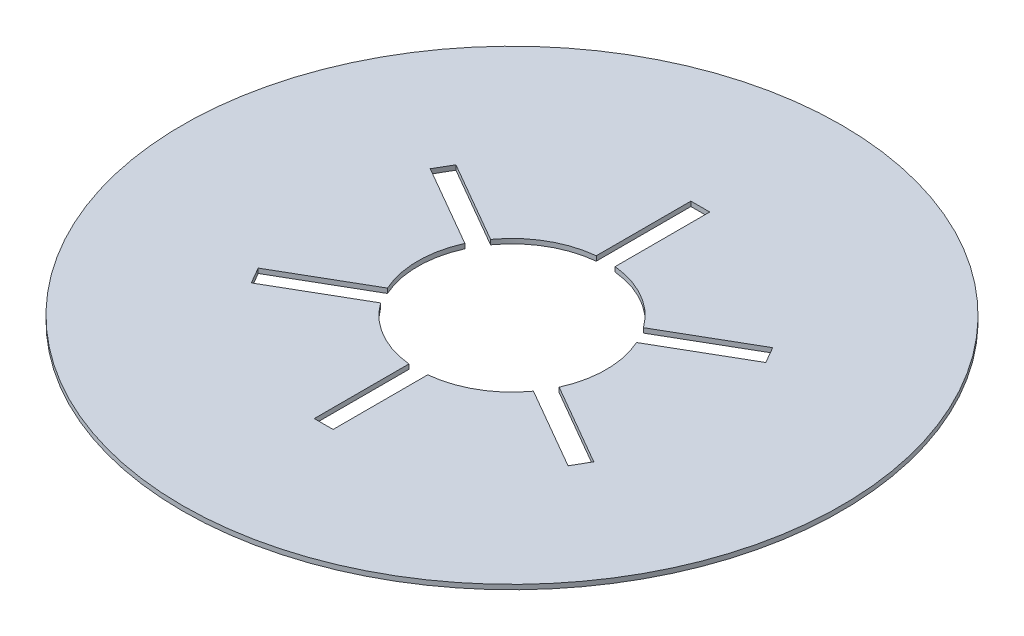
ISO-10303-21;
HEADER;
FILE_DESCRIPTION(('STEP AP214'),'2;1');
FILE_NAME('part.step','',(''),(''),'','','');
FILE_SCHEMA(('AUTOMOTIVE_DESIGN { 1 0 10303 214 1 1 1 1 }'));
ENDSEC;
DATA;
#1=APPLICATION_CONTEXT('core data for automotive mechanical design processes');
#2=APPLICATION_PROTOCOL_DEFINITION('international standard','automotive_design',2000,#1);
#3=PRODUCT_CONTEXT('',#1,'mechanical');
#4=PRODUCT('Part','Part','',(#3));
#5=PRODUCT_RELATED_PRODUCT_CATEGORY('part','',(#4));
#6=PRODUCT_DEFINITION_FORMATION('','',#4);
#7=PRODUCT_DEFINITION_CONTEXT('part definition',#1,'design');
#8=PRODUCT_DEFINITION('design','',#6,#7);
#9=PRODUCT_DEFINITION_SHAPE('','',#8);
#10=(LENGTH_UNIT() NAMED_UNIT(*) SI_UNIT(.MILLI.,.METRE.));
#11=(NAMED_UNIT(*) PLANE_ANGLE_UNIT() SI_UNIT($,.RADIAN.));
#12=(NAMED_UNIT(*) SI_UNIT($,.STERADIAN.) SOLID_ANGLE_UNIT());
#13=UNCERTAINTY_MEASURE_WITH_UNIT(LENGTH_MEASURE(1.E-05),#10,'distance_accuracy_value','');
#14=(GEOMETRIC_REPRESENTATION_CONTEXT(3) GLOBAL_UNCERTAINTY_ASSIGNED_CONTEXT((#13)) GLOBAL_UNIT_ASSIGNED_CONTEXT((#10,
#11,#12)) REPRESENTATION_CONTEXT('',''));
#15=CARTESIAN_POINT('',(0.,0.,0.));
#16=DIRECTION('',(0.,0.,1.));
#17=DIRECTION('',(1.,0.,0.));
#18=AXIS2_PLACEMENT_3D('',#15,#16,#17);
#19=CARTESIAN_POINT('',(0.,5.,0.));
#20=DIRECTION('',(0.,-1.,0.));
#21=DIRECTION('',(0.,0.,-1.));
#22=AXIS2_PLACEMENT_3D('',#19,#20,#21);
#23=CYLINDRICAL_SURFACE('',#22,100.);
#24=CARTESIAN_POINT('',(0.,0.,0.));
#25=DIRECTION('',(0.,1.,0.));
#26=DIRECTION('',(0.,0.,1.));
#27=AXIS2_PLACEMENT_3D('',#24,#25,#26);
#28=CIRCLE('',#27,100.);
#29=CARTESIAN_POINT('',(-81.1684396981752,0.,58.4096258930298));
#30=VERTEX_POINT('',#29);
#31=CARTESIAN_POINT('',(-10.,0.,99.498743710662));
#32=VERTEX_POINT('',#31);
#33=EDGE_CURVE('E227',#30,#32,#28,.T.);
#34=ORIENTED_EDGE('',*,*,#33,.F.);
#35=DIRECTION('',(0.,-1.,0.));
#36=VECTOR('',#35,1.);
#37=CARTESIAN_POINT('',(-81.1684396981752,5.,58.4096258930298));
#38=LINE('',#37,#36);
#39=CARTESIAN_POINT('',(-81.1684396981752,5.,58.4096258930298));
#40=VERTEX_POINT('',#39);
#41=EDGE_CURVE('E11',#40,#30,#38,.T.);
#42=ORIENTED_EDGE('',*,*,#41,.F.);
#43=CARTESIAN_POINT('',(0.,5.,0.));
#44=DIRECTION('',(0.,1.,0.));
#45=DIRECTION('',(0.,0.,1.));
#46=AXIS2_PLACEMENT_3D('',#43,#44,#45);
#47=CIRCLE('',#46,100.);
#48=CARTESIAN_POINT('',(-10.,5.,99.498743710662));
#49=VERTEX_POINT('',#48);
#50=EDGE_CURVE('E293',#40,#49,#47,.T.);
#51=ORIENTED_EDGE('',*,*,#50,.T.);
#52=DIRECTION('',(0.,-1.,0.));
#53=VECTOR('',#52,1.);
#54=CARTESIAN_POINT('',(-10.,5.,99.498743710662));
#55=LINE('',#54,#53);
#56=EDGE_CURVE('E49',#49,#32,#55,.T.);
#57=ORIENTED_EDGE('',*,*,#56,.T.);
#58=EDGE_LOOP('',(#34,#42,#51,#57));
#59=FACE_BOUND('',#58,.T.);
#60=ADVANCED_FACE('F33',(#59),#23,.F.);
#61=CARTESIAN_POINT('',(4.99999999991079,5.,8.66025403768987));
#62=DIRECTION('',(0.5,0.,0.866025403784439));
#63=DIRECTION('',(0.866025403784439,0.,-0.5));
#64=AXIS2_PLACEMENT_3D('',#61,#62,#63);
#65=PLANE('',#64);
#66=DIRECTION('',(-0.866025403784439,0.,0.5));
#67=VECTOR('',#66,1.);
#68=CARTESIAN_POINT('',(4.99999999991079,0.,8.66025403768987));
#69=LINE('',#68,#67);
#70=CARTESIAN_POINT('',(-168.205080756709,0.,108.660254037535));
#71=VERTEX_POINT('',#70);
#72=EDGE_CURVE('E229',#30,#71,#69,.T.);
#73=ORIENTED_EDGE('',*,*,#72,.T.);
#74=DIRECTION('',(0.,-1.,0.));
#75=VECTOR('',#74,1.);
#76=CARTESIAN_POINT('',(-168.205080756709,5.,108.660254037535));
#77=LINE('',#76,#75);
#78=CARTESIAN_POINT('',(-168.205080756709,5.,108.660254037535));
#79=VERTEX_POINT('',#78);
#80=EDGE_CURVE('E41',#79,#71,#77,.T.);
#81=ORIENTED_EDGE('',*,*,#80,.F.);
#82=DIRECTION('',(-0.866025403784439,0.,0.5));
#83=VECTOR('',#82,1.);
#84=CARTESIAN_POINT('',(4.99999999991079,5.,8.66025403768987));
#85=LINE('',#84,#83);
#86=EDGE_CURVE('E363',#40,#79,#85,.T.);
#87=ORIENTED_EDGE('',*,*,#86,.F.);
#88=ORIENTED_EDGE('',*,*,#41,.T.);
#89=EDGE_LOOP('',(#73,#81,#87,#88));
#90=FACE_BOUND('',#89,.T.);
#91=ADVANCED_FACE('F418',(#90),#65,.F.);
#92=CARTESIAN_POINT('',(-173.20508075662,5.,99.9999999998454));
#93=DIRECTION('',(-0.866025403784438,0.,0.5));
#94=DIRECTION('',(0.5,0.,0.866025403784438));
#95=AXIS2_PLACEMENT_3D('',#92,#93,#94);
#96=PLANE('',#95);
#97=DIRECTION('',(-0.5,0.,-0.866025403784438));
#98=VECTOR('',#97,1.);
#99=CARTESIAN_POINT('',(-173.20508075662,0.,99.9999999998454));
#100=LINE('',#99,#98);
#101=CARTESIAN_POINT('',(-178.205080756709,0.,91.3397459618464));
#102=VERTEX_POINT('',#101);
#103=EDGE_CURVE('E231',#71,#102,#100,.T.);
#104=ORIENTED_EDGE('',*,*,#103,.T.);
#105=DIRECTION('',(0.,-1.,0.));
#106=VECTOR('',#105,1.);
#107=CARTESIAN_POINT('',(-178.205080756709,5.,91.3397459618464));
#108=LINE('',#107,#106);
#109=CARTESIAN_POINT('',(-178.205080756709,5.,91.3397459618464));
#110=VERTEX_POINT('',#109);
#111=EDGE_CURVE('E335',#110,#102,#108,.T.);
#112=ORIENTED_EDGE('',*,*,#111,.F.);
#113=DIRECTION('',(-0.5,0.,-0.866025403784438));
#114=VECTOR('',#113,1.);
#115=CARTESIAN_POINT('',(-173.20508075662,5.,99.9999999998454));
#116=LINE('',#115,#114);
#117=EDGE_CURVE('E343',#79,#110,#116,.T.);
#118=ORIENTED_EDGE('',*,*,#117,.F.);
#119=ORIENTED_EDGE('',*,*,#80,.T.);
#120=EDGE_LOOP('',(#104,#112,#118,#119));
#121=FACE_BOUND('',#120,.T.);
#122=ADVANCED_FACE('F341',(#121),#96,.F.);
#123=CARTESIAN_POINT('',(-5.00000000008927,5.,-8.660254037999));
#124=DIRECTION('',(0.5,0.,0.866025403784438));
#125=DIRECTION('',(0.866025403784438,0.,-0.5));
#126=AXIS2_PLACEMENT_3D('',#123,#124,#125);
#127=PLANE('',#126);
#128=DIRECTION('',(-0.866025403784439,0.,0.5));
#129=VECTOR('',#128,1.);
#130=CARTESIAN_POINT('',(-5.00000000008927,0.,-8.660254037999));
#131=LINE('',#130,#129);
#132=CARTESIAN_POINT('',(-91.1684396981441,0.,41.089117817323));
#133=VERTEX_POINT('',#132);
#134=EDGE_CURVE('E234',#133,#102,#131,.T.);
#135=ORIENTED_EDGE('',*,*,#134,.F.);
#136=DIRECTION('',(0.,-1.,0.));
#137=VECTOR('',#136,1.);
#138=CARTESIAN_POINT('',(-91.1684396981441,5.,41.089117817323));
#139=LINE('',#138,#137);
#140=CARTESIAN_POINT('',(-91.1684396981441,5.,41.089117817323));
#141=VERTEX_POINT('',#140);
#142=EDGE_CURVE('E333',#141,#133,#139,.T.);
#143=ORIENTED_EDGE('',*,*,#142,.F.);
#144=DIRECTION('',(-0.866025403784439,0.,0.5));
#145=VECTOR('',#144,1.);
#146=CARTESIAN_POINT('',(-5.00000000008927,5.,-8.660254037999));
#147=LINE('',#146,#145);
#148=EDGE_CURVE('E356',#141,#110,#147,.T.);
#149=ORIENTED_EDGE('',*,*,#148,.T.);
#150=ORIENTED_EDGE('',*,*,#111,.T.);
#151=EDGE_LOOP('',(#135,#143,#149,#150));
#152=FACE_BOUND('',#151,.T.);
#153=ADVANCED_FACE('F353',(#152),#127,.T.);
#154=CARTESIAN_POINT('',(0.,5.,0.));
#155=DIRECTION('',(0.,-1.,0.));
#156=DIRECTION('',(0.,0.,-1.));
#157=AXIS2_PLACEMENT_3D('',#154,#155,#156);
#158=CYLINDRICAL_SURFACE('',#157,100.);
#159=CARTESIAN_POINT('',(0.,0.,0.));
#160=DIRECTION('',(0.,1.,0.));
#161=DIRECTION('',(0.,0.,1.));
#162=AXIS2_PLACEMENT_3D('',#159,#160,#161);
#163=CIRCLE('',#162,100.);
#164=CARTESIAN_POINT('',(-91.1684396979967,0.,-41.0891178176502));
#165=VERTEX_POINT('',#164);
#166=EDGE_CURVE('E237',#165,#133,#163,.T.);
#167=ORIENTED_EDGE('',*,*,#166,.F.);
#168=DIRECTION('',(0.,-1.,0.));
#169=VECTOR('',#168,1.);
#170=CARTESIAN_POINT('',(-91.1684396979967,5.,-41.0891178176502));
#171=LINE('',#170,#169);
#172=CARTESIAN_POINT('',(-91.1684396979967,5.,-41.0891178176502));
#173=VERTEX_POINT('',#172);
#174=EDGE_CURVE('E331',#173,#165,#171,.T.);
#175=ORIENTED_EDGE('',*,*,#174,.F.);
#176=CARTESIAN_POINT('',(0.,5.,0.));
#177=DIRECTION('',(0.,1.,0.));
#178=DIRECTION('',(0.,0.,1.));
#179=AXIS2_PLACEMENT_3D('',#176,#177,#178);
#180=CIRCLE('',#179,100.);
#181=EDGE_CURVE('E359',#173,#141,#180,.T.);
#182=ORIENTED_EDGE('',*,*,#181,.T.);
#183=ORIENTED_EDGE('',*,*,#142,.T.);
#184=EDGE_LOOP('',(#167,#175,#182,#183));
#185=FACE_BOUND('',#184,.T.);
#186=ADVANCED_FACE('F429',(#185),#158,.F.);
#187=CARTESIAN_POINT('',(-4.9999999999107,5.,8.66025403768974));
#188=DIRECTION('',(-0.499999999999999,0.,0.866025403784439));
#189=DIRECTION('',(0.866025403784439,0.,0.499999999999999));
#190=AXIS2_PLACEMENT_3D('',#187,#188,#189);
#191=PLANE('',#190);
#192=DIRECTION('',(-0.866025403784439,0.,-0.499999999999999));
#193=VECTOR('',#192,1.);
#194=CARTESIAN_POINT('',(-4.9999999999107,0.,8.66025403768974));
#195=LINE('',#194,#193);
#196=CARTESIAN_POINT('',(-178.205080756709,0.,-91.3397459622586));
#197=VERTEX_POINT('',#196);
#198=EDGE_CURVE('E240',#165,#197,#195,.T.);
#199=ORIENTED_EDGE('',*,*,#198,.T.);
#200=DIRECTION('',(0.,-1.,0.));
#201=VECTOR('',#200,1.);
#202=CARTESIAN_POINT('',(-178.205080756709,5.,-91.3397459622586));
#203=LINE('',#202,#201);
#204=CARTESIAN_POINT('',(-178.205080756709,5.,-91.3397459622586));
#205=VERTEX_POINT('',#204);
#206=EDGE_CURVE('E328',#205,#197,#203,.T.);
#207=ORIENTED_EDGE('',*,*,#206,.F.);
#208=DIRECTION('',(-0.866025403784439,0.,-0.499999999999999));
#209=VECTOR('',#208,1.);
#210=CARTESIAN_POINT('',(-4.9999999999107,5.,8.66025403768974));
#211=LINE('',#210,#209);
#212=EDGE_CURVE('E361',#173,#205,#211,.T.);
#213=ORIENTED_EDGE('',*,*,#212,.F.);
#214=ORIENTED_EDGE('',*,*,#174,.T.);
#215=EDGE_LOOP('',(#199,#207,#213,#214));
#216=FACE_BOUND('',#215,.T.);
#217=ADVANCED_FACE('F432',(#216),#191,.F.);
#218=CARTESIAN_POINT('',(-173.205080756798,5.,-99.9999999999485));
#219=DIRECTION('',(-0.866025403784438,0.,-0.5));
#220=DIRECTION('',(-0.5,0.,0.866025403784438));
#221=AXIS2_PLACEMENT_3D('',#218,#219,#220);
#222=PLANE('',#221);
#223=DIRECTION('',(0.5,0.,-0.866025403784438));
#224=VECTOR('',#223,1.);
#225=CARTESIAN_POINT('',(-173.205080756798,0.,-99.9999999999485));
#226=LINE('',#225,#224);
#227=CARTESIAN_POINT('',(-168.205080756709,0.,-108.660254037947));
#228=VERTEX_POINT('',#227);
#229=EDGE_CURVE('E242',#197,#228,#226,.T.);
#230=ORIENTED_EDGE('',*,*,#229,.T.);
#231=DIRECTION('',(0.,-1.,0.));
#232=VECTOR('',#231,1.);
#233=CARTESIAN_POINT('',(-168.205080756709,5.,-108.660254037947));
#234=LINE('',#233,#232);
#235=CARTESIAN_POINT('',(-168.205080756709,5.,-108.660254037947));
#236=VERTEX_POINT('',#235);
#237=EDGE_CURVE('E326',#236,#228,#234,.T.);
#238=ORIENTED_EDGE('',*,*,#237,.F.);
#239=DIRECTION('',(0.5,0.,-0.866025403784438));
#240=VECTOR('',#239,1.);
#241=CARTESIAN_POINT('',(-173.205080756798,5.,-99.9999999999485));
#242=LINE('',#241,#240);
#243=EDGE_CURVE('E368',#205,#236,#242,.T.);
#244=ORIENTED_EDGE('',*,*,#243,.F.);
#245=ORIENTED_EDGE('',*,*,#206,.T.);
#246=EDGE_LOOP('',(#230,#238,#244,#245));
#247=FACE_BOUND('',#246,.T.);
#248=ADVANCED_FACE('F436',(#247),#222,.F.);
#249=CARTESIAN_POINT('',(5.00000000008936,5.,-8.6602540379992));
#250=DIRECTION('',(-0.499999999999999,0.,0.86602540378444));
#251=DIRECTION('',(0.86602540378444,0.,0.499999999999999));
#252=AXIS2_PLACEMENT_3D('',#249,#250,#251);
#253=PLANE('',#252);
#254=DIRECTION('',(-0.86602540378444,0.,-0.499999999999999));
#255=VECTOR('',#254,1.);
#256=CARTESIAN_POINT('',(5.00000000008936,0.,-8.6602540379992));
#257=LINE('',#256,#255);
#258=CARTESIAN_POINT('',(-81.1684396979656,0.,-58.4096258933211));
#259=VERTEX_POINT('',#258);
#260=EDGE_CURVE('E245',#259,#228,#257,.T.);
#261=ORIENTED_EDGE('',*,*,#260,.F.);
#262=DIRECTION('',(0.,-1.,0.));
#263=VECTOR('',#262,1.);
#264=CARTESIAN_POINT('',(-81.1684396979656,5.,-58.4096258933211));
#265=LINE('',#264,#263);
#266=CARTESIAN_POINT('',(-81.1684396979656,5.,-58.4096258933211));
#267=VERTEX_POINT('',#266);
#268=EDGE_CURVE('E324',#267,#259,#265,.T.);
#269=ORIENTED_EDGE('',*,*,#268,.F.);
#270=DIRECTION('',(-0.86602540378444,0.,-0.499999999999999));
#271=VECTOR('',#270,1.);
#272=CARTESIAN_POINT('',(5.00000000008936,5.,-8.6602540379992));
#273=LINE('',#272,#271);
#274=EDGE_CURVE('E370',#267,#236,#273,.T.);
#275=ORIENTED_EDGE('',*,*,#274,.T.);
#276=ORIENTED_EDGE('',*,*,#237,.T.);
#277=EDGE_LOOP('',(#261,#269,#275,#276));
#278=FACE_BOUND('',#277,.T.);
#279=ADVANCED_FACE('F440',(#278),#253,.T.);
#280=CARTESIAN_POINT('',(0.,5.,0.));
#281=DIRECTION('',(0.,-1.,0.));
#282=DIRECTION('',(0.,0.,-1.));
#283=AXIS2_PLACEMENT_3D('',#280,#281,#282);
#284=CYLINDRICAL_SURFACE('',#283,100.);
#285=CARTESIAN_POINT('',(0.,0.,0.));
#286=DIRECTION('',(0.,1.,0.));
#287=DIRECTION('',(0.,0.,1.));
#288=AXIS2_PLACEMENT_3D('',#285,#286,#287);
#289=CIRCLE('',#288,100.);
#290=CARTESIAN_POINT('',(-10.,0.,-99.498743710662));
#291=VERTEX_POINT('',#290);
#292=EDGE_CURVE('E248',#291,#259,#289,.T.);
#293=ORIENTED_EDGE('',*,*,#292,.F.);
#294=DIRECTION('',(0.,-1.,0.));
#295=VECTOR('',#294,1.);
#296=CARTESIAN_POINT('',(-10.,5.,-99.498743710662));
#297=LINE('',#296,#295);
#298=CARTESIAN_POINT('',(-10.,5.,-99.498743710662));
#299=VERTEX_POINT('',#298);
#300=EDGE_CURVE('E322',#299,#291,#297,.T.);
#301=ORIENTED_EDGE('',*,*,#300,.F.);
#302=CARTESIAN_POINT('',(0.,5.,0.));
#303=DIRECTION('',(0.,1.,0.));
#304=DIRECTION('',(0.,0.,1.));
#305=AXIS2_PLACEMENT_3D('',#302,#303,#304);
#306=CIRCLE('',#305,100.);
#307=EDGE_CURVE('E373',#299,#267,#306,.T.);
#308=ORIENTED_EDGE('',*,*,#307,.T.);
#309=ORIENTED_EDGE('',*,*,#268,.T.);
#310=EDGE_LOOP('',(#293,#301,#308,#309));
#311=FACE_BOUND('',#310,.T.);
#312=ADVANCED_FACE('F444',(#311),#284,.F.);
#313=CARTESIAN_POINT('',(-10.,5.,0.));
#314=DIRECTION('',(-1.,0.,0.));
#315=DIRECTION('',(0.,0.,1.));
#316=AXIS2_PLACEMENT_3D('',#313,#314,#315);
#317=PLANE('',#316);
#318=DIRECTION('',(0.,0.,-1.));
#319=VECTOR('',#318,1.);
#320=CARTESIAN_POINT('',(-10.,0.,0.));
#321=LINE('',#320,#319);
#322=CARTESIAN_POINT('',(-10.,0.,-200.));
#323=VERTEX_POINT('',#322);
#324=EDGE_CURVE('E251',#291,#323,#321,.T.);
#325=ORIENTED_EDGE('',*,*,#324,.T.);
#326=DIRECTION('',(0.,-1.,0.));
#327=VECTOR('',#326,1.);
#328=CARTESIAN_POINT('',(-10.,5.,-200.));
#329=LINE('',#328,#327);
#330=CARTESIAN_POINT('',(-10.,5.,-200.));
#331=VERTEX_POINT('',#330);
#332=EDGE_CURVE('E319',#331,#323,#329,.T.);
#333=ORIENTED_EDGE('',*,*,#332,.F.);
#334=DIRECTION('',(0.,0.,-1.));
#335=VECTOR('',#334,1.);
#336=CARTESIAN_POINT('',(-10.,5.,0.));
#337=LINE('',#336,#335);
#338=EDGE_CURVE('E376',#299,#331,#337,.T.);
#339=ORIENTED_EDGE('',*,*,#338,.F.);
#340=ORIENTED_EDGE('',*,*,#300,.T.);
#341=EDGE_LOOP('',(#325,#333,#339,#340));
#342=FACE_BOUND('',#341,.T.);
#343=ADVANCED_FACE('F448',(#342),#317,.F.);
#344=CARTESIAN_POINT('',(0.,5.,-200.));
#345=DIRECTION('',(0.,0.,-1.));
#346=DIRECTION('',(-1.,0.,0.));
#347=AXIS2_PLACEMENT_3D('',#344,#345,#346);
#348=PLANE('',#347);
#349=DIRECTION('',(1.,0.,0.));
#350=VECTOR('',#349,1.);
#351=CARTESIAN_POINT('',(0.,0.,-200.));
#352=LINE('',#351,#350);
#353=CARTESIAN_POINT('',(10.,0.,-200.));
#354=VERTEX_POINT('',#353);
#355=EDGE_CURVE('E253',#323,#354,#352,.T.);
#356=ORIENTED_EDGE('',*,*,#355,.T.);
#357=DIRECTION('',(0.,-1.,0.));
#358=VECTOR('',#357,1.);
#359=CARTESIAN_POINT('',(10.,5.,-200.));
#360=LINE('',#359,#358);
#361=CARTESIAN_POINT('',(10.,5.,-200.));
#362=VERTEX_POINT('',#361);
#363=EDGE_CURVE('E317',#362,#354,#360,.T.);
#364=ORIENTED_EDGE('',*,*,#363,.F.);
#365=DIRECTION('',(1.,0.,0.));
#366=VECTOR('',#365,1.);
#367=CARTESIAN_POINT('',(0.,5.,-200.));
#368=LINE('',#367,#366);
#369=EDGE_CURVE('E378',#331,#362,#368,.T.);
#370=ORIENTED_EDGE('',*,*,#369,.F.);
#371=ORIENTED_EDGE('',*,*,#332,.T.);
#372=EDGE_LOOP('',(#356,#364,#370,#371));
#373=FACE_BOUND('',#372,.T.);
#374=ADVANCED_FACE('F452',(#373),#348,.F.);
#375=CARTESIAN_POINT('',(10.,5.,0.));
#376=DIRECTION('',(-1.,0.,0.));
#377=DIRECTION('',(0.,0.,1.));
#378=AXIS2_PLACEMENT_3D('',#375,#376,#377);
#379=PLANE('',#378);
#380=DIRECTION('',(0.,0.,-1.));
#381=VECTOR('',#380,1.);
#382=CARTESIAN_POINT('',(10.,0.,0.));
#383=LINE('',#382,#381);
#384=CARTESIAN_POINT('',(10.,0.,-99.498743710662));
#385=VERTEX_POINT('',#384);
#386=EDGE_CURVE('E256',#385,#354,#383,.T.);
#387=ORIENTED_EDGE('',*,*,#386,.F.);
#388=DIRECTION('',(0.,-1.,0.));
#389=VECTOR('',#388,1.);
#390=CARTESIAN_POINT('',(10.,5.,-99.498743710662));
#391=LINE('',#390,#389);
#392=CARTESIAN_POINT('',(10.,5.,-99.498743710662));
#393=VERTEX_POINT('',#392);
#394=EDGE_CURVE('E315',#393,#385,#391,.T.);
#395=ORIENTED_EDGE('',*,*,#394,.F.);
#396=DIRECTION('',(0.,0.,-1.));
#397=VECTOR('',#396,1.);
#398=CARTESIAN_POINT('',(10.,5.,0.));
#399=LINE('',#398,#397);
#400=EDGE_CURVE('E380',#393,#362,#399,.T.);
#401=ORIENTED_EDGE('',*,*,#400,.T.);
#402=ORIENTED_EDGE('',*,*,#363,.T.);
#403=EDGE_LOOP('',(#387,#395,#401,#402));
#404=FACE_BOUND('',#403,.T.);
#405=ADVANCED_FACE('F456',(#404),#379,.T.);
#406=CARTESIAN_POINT('',(0.,5.,0.));
#407=DIRECTION('',(0.,-1.,0.));
#408=DIRECTION('',(0.,0.,-1.));
#409=AXIS2_PLACEMENT_3D('',#406,#407,#408);
#410=CYLINDRICAL_SURFACE('',#409,100.);
#411=CARTESIAN_POINT('',(0.,0.,0.));
#412=DIRECTION('',(0.,1.,0.));
#413=DIRECTION('',(0.,0.,1.));
#414=AXIS2_PLACEMENT_3D('',#411,#412,#413);
#415=CIRCLE('',#414,100.);
#416=CARTESIAN_POINT('',(81.1684396979655,0.,-58.4096258933212));
#417=VERTEX_POINT('',#416);
#418=EDGE_CURVE('E259',#417,#385,#415,.T.);
#419=ORIENTED_EDGE('',*,*,#418,.F.);
#420=DIRECTION('',(0.,-1.,0.));
#421=VECTOR('',#420,1.);
#422=CARTESIAN_POINT('',(81.1684396979655,5.,-58.4096258933212));
#423=LINE('',#422,#421);
#424=CARTESIAN_POINT('',(81.1684396979655,5.,-58.4096258933212));
#425=VERTEX_POINT('',#424);
#426=EDGE_CURVE('E313',#425,#417,#423,.T.);
#427=ORIENTED_EDGE('',*,*,#426,.F.);
#428=CARTESIAN_POINT('',(0.,5.,0.));
#429=DIRECTION('',(0.,1.,0.));
#430=DIRECTION('',(0.,0.,1.));
#431=AXIS2_PLACEMENT_3D('',#428,#429,#430);
#432=CIRCLE('',#431,100.);
#433=EDGE_CURVE('E383',#425,#393,#432,.T.);
#434=ORIENTED_EDGE('',*,*,#433,.T.);
#435=ORIENTED_EDGE('',*,*,#394,.T.);
#436=EDGE_LOOP('',(#419,#427,#434,#435));
#437=FACE_BOUND('',#436,.T.);
#438=ADVANCED_FACE('F460',(#437),#410,.F.);
#439=CARTESIAN_POINT('',(-5.00000000008938,5.,-8.66025403799922));
#440=DIRECTION('',(-0.499999999999999,0.,-0.866025403784439));
#441=DIRECTION('',(-0.866025403784439,0.,0.499999999999999));
#442=AXIS2_PLACEMENT_3D('',#439,#440,#441);
#443=PLANE('',#442);
#444=DIRECTION('',(0.866025403784439,0.,-0.499999999999999));
#445=VECTOR('',#444,1.);
#446=CARTESIAN_POINT('',(-5.00000000008938,0.,-8.66025403799922));
#447=LINE('',#446,#445);
#448=CARTESIAN_POINT('',(168.205080756709,0.,-108.660254037948));
#449=VERTEX_POINT('',#448);
#450=EDGE_CURVE('E262',#417,#449,#447,.T.);
#451=ORIENTED_EDGE('',*,*,#450,.T.);
#452=DIRECTION('',(0.,-1.,0.));
#453=VECTOR('',#452,1.);
#454=CARTESIAN_POINT('',(168.205080756709,5.,-108.660254037948));
#455=LINE('',#454,#453);
#456=CARTESIAN_POINT('',(168.205080756709,5.,-108.660254037948));
#457=VERTEX_POINT('',#456);
#458=EDGE_CURVE('E310',#457,#449,#455,.T.);
#459=ORIENTED_EDGE('',*,*,#458,.F.);
#460=DIRECTION('',(0.866025403784439,0.,-0.499999999999999));
#461=VECTOR('',#460,1.);
#462=CARTESIAN_POINT('',(-5.00000000008938,5.,-8.66025403799922));
#463=LINE('',#462,#461);
#464=EDGE_CURVE('E386',#425,#457,#463,.T.);
#465=ORIENTED_EDGE('',*,*,#464,.F.);
#466=ORIENTED_EDGE('',*,*,#426,.T.);
#467=EDGE_LOOP('',(#451,#459,#465,#466));
#468=FACE_BOUND('',#467,.T.);
#469=ADVANCED_FACE('F464',(#468),#443,.F.);
#470=CARTESIAN_POINT('',(173.205080756798,5.,-99.9999999999485));
#471=DIRECTION('',(0.866025403784438,0.,-0.5));
#472=DIRECTION('',(-0.5,0.,-0.866025403784438));
#473=AXIS2_PLACEMENT_3D('',#470,#471,#472);
#474=PLANE('',#473);
#475=DIRECTION('',(0.5,0.,0.866025403784438));
#476=VECTOR('',#475,1.);
#477=CARTESIAN_POINT('',(173.205080756798,0.,-99.9999999999485));
#478=LINE('',#477,#476);
#479=CARTESIAN_POINT('',(178.205080756709,0.,-91.3397459622587));
#480=VERTEX_POINT('',#479);
#481=EDGE_CURVE('E264',#449,#480,#478,.T.);
#482=ORIENTED_EDGE('',*,*,#481,.T.);
#483=DIRECTION('',(0.,-1.,0.));
#484=VECTOR('',#483,1.);
#485=CARTESIAN_POINT('',(178.205080756709,5.,-91.3397459622587));
#486=LINE('',#485,#484);
#487=CARTESIAN_POINT('',(178.205080756709,5.,-91.3397459622587));
#488=VERTEX_POINT('',#487);
#489=EDGE_CURVE('E308',#488,#480,#486,.T.);
#490=ORIENTED_EDGE('',*,*,#489,.F.);
#491=DIRECTION('',(0.5,0.,0.866025403784438));
#492=VECTOR('',#491,1.);
#493=CARTESIAN_POINT('',(173.205080756798,5.,-99.9999999999485));
#494=LINE('',#493,#492);
#495=EDGE_CURVE('E388',#457,#488,#494,.T.);
#496=ORIENTED_EDGE('',*,*,#495,.F.);
#497=ORIENTED_EDGE('',*,*,#458,.T.);
#498=EDGE_LOOP('',(#482,#490,#496,#497));
#499=FACE_BOUND('',#498,.T.);
#500=ADVANCED_FACE('F468',(#499),#474,.F.);
#501=CARTESIAN_POINT('',(4.99999999991073,5.,8.66025403768976));
#502=DIRECTION('',(-0.5,0.,-0.866025403784438));
#503=DIRECTION('',(-0.866025403784438,0.,0.5));
#504=AXIS2_PLACEMENT_3D('',#501,#502,#503);
#505=PLANE('',#504);
#506=DIRECTION('',(0.866025403784439,0.,-0.5));
#507=VECTOR('',#506,1.);
#508=CARTESIAN_POINT('',(4.99999999991073,0.,8.66025403768976));
#509=LINE('',#508,#507);
#510=CARTESIAN_POINT('',(91.1684396979967,0.,-41.0891178176502));
#511=VERTEX_POINT('',#510);
#512=EDGE_CURVE('E267',#511,#480,#509,.T.);
#513=ORIENTED_EDGE('',*,*,#512,.F.);
#514=DIRECTION('',(0.,-1.,0.));
#515=VECTOR('',#514,1.);
#516=CARTESIAN_POINT('',(91.1684396979967,5.,-41.0891178176502));
#517=LINE('',#516,#515);
#518=CARTESIAN_POINT('',(91.1684396979967,5.,-41.0891178176502));
#519=VERTEX_POINT('',#518);
#520=EDGE_CURVE('E306',#519,#511,#517,.T.);
#521=ORIENTED_EDGE('',*,*,#520,.F.);
#522=DIRECTION('',(0.866025403784439,0.,-0.5));
#523=VECTOR('',#522,1.);
#524=CARTESIAN_POINT('',(4.99999999991073,5.,8.66025403768976));
#525=LINE('',#524,#523);
#526=EDGE_CURVE('E390',#519,#488,#525,.T.);
#527=ORIENTED_EDGE('',*,*,#526,.T.);
#528=ORIENTED_EDGE('',*,*,#489,.T.);
#529=EDGE_LOOP('',(#513,#521,#527,#528));
#530=FACE_BOUND('',#529,.T.);
#531=ADVANCED_FACE('F472',(#530),#505,.T.);
#532=CARTESIAN_POINT('',(0.,5.,0.));
#533=DIRECTION('',(0.,-1.,0.));
#534=DIRECTION('',(0.,0.,-1.));
#535=AXIS2_PLACEMENT_3D('',#532,#533,#534);
#536=CYLINDRICAL_SURFACE('',#535,100.);
#537=CARTESIAN_POINT('',(0.,0.,0.));
#538=DIRECTION('',(0.,1.,0.));
#539=DIRECTION('',(0.,0.,1.));
#540=AXIS2_PLACEMENT_3D('',#537,#538,#539);
#541=CIRCLE('',#540,100.);
#542=CARTESIAN_POINT('',(91.1684396981443,0.,41.0891178173228));
#543=VERTEX_POINT('',#542);
#544=EDGE_CURVE('E270',#543,#511,#541,.T.);
#545=ORIENTED_EDGE('',*,*,#544,.F.);
#546=DIRECTION('',(0.,-1.,0.));
#547=VECTOR('',#546,1.);
#548=CARTESIAN_POINT('',(91.1684396981443,5.,41.0891178173228));
#549=LINE('',#548,#547);
#550=CARTESIAN_POINT('',(91.1684396981443,5.,41.0891178173228));
#551=VERTEX_POINT('',#550);
#552=EDGE_CURVE('E304',#551,#543,#549,.T.);
#553=ORIENTED_EDGE('',*,*,#552,.F.);
#554=CARTESIAN_POINT('',(0.,5.,0.));
#555=DIRECTION('',(0.,1.,0.));
#556=DIRECTION('',(0.,0.,1.));
#557=AXIS2_PLACEMENT_3D('',#554,#555,#556);
#558=CIRCLE('',#557,100.);
#559=EDGE_CURVE('E393',#551,#519,#558,.T.);
#560=ORIENTED_EDGE('',*,*,#559,.T.);
#561=ORIENTED_EDGE('',*,*,#520,.T.);
#562=EDGE_LOOP('',(#545,#553,#560,#561));
#563=FACE_BOUND('',#562,.T.);
#564=ADVANCED_FACE('F476',(#563),#536,.F.);
#565=CARTESIAN_POINT('',(5.00000000008952,5.,-8.66025403799939));
#566=DIRECTION('',(0.500000000000002,0.,-0.866025403784438));
#567=DIRECTION('',(-0.866025403784438,0.,-0.500000000000002));
#568=AXIS2_PLACEMENT_3D('',#565,#566,#567);
#569=PLANE('',#568);
#570=DIRECTION('',(0.866025403784438,0.,0.500000000000002));
#571=VECTOR('',#570,1.);
#572=CARTESIAN_POINT('',(5.00000000008952,0.,-8.66025403799939));
#573=LINE('',#572,#571);
#574=CARTESIAN_POINT('',(178.205080756709,0.,91.3397459618463));
#575=VERTEX_POINT('',#574);
#576=EDGE_CURVE('E273',#543,#575,#573,.T.);
#577=ORIENTED_EDGE('',*,*,#576,.T.);
#578=DIRECTION('',(0.,-1.,0.));
#579=VECTOR('',#578,1.);
#580=CARTESIAN_POINT('',(178.205080756709,5.,91.3397459618463));
#581=LINE('',#580,#579);
#582=CARTESIAN_POINT('',(178.205080756709,5.,91.3397459618463));
#583=VERTEX_POINT('',#582);
#584=EDGE_CURVE('E301',#583,#575,#581,.T.);
#585=ORIENTED_EDGE('',*,*,#584,.F.);
#586=DIRECTION('',(0.866025403784438,0.,0.500000000000002));
#587=VECTOR('',#586,1.);
#588=CARTESIAN_POINT('',(5.00000000008952,5.,-8.66025403799939));
#589=LINE('',#588,#587);
#590=EDGE_CURVE('E396',#551,#583,#589,.T.);
#591=ORIENTED_EDGE('',*,*,#590,.F.);
#592=ORIENTED_EDGE('',*,*,#552,.T.);
#593=EDGE_LOOP('',(#577,#585,#591,#592));
#594=FACE_BOUND('',#593,.T.);
#595=ADVANCED_FACE('F480',(#594),#569,.F.);
#596=CARTESIAN_POINT('',(173.20508075662,5.,99.9999999998454));
#597=DIRECTION('',(0.866025403784438,0.,0.5));
#598=DIRECTION('',(0.5,0.,-0.866025403784438));
#599=AXIS2_PLACEMENT_3D('',#596,#597,#598);
#600=PLANE('',#599);
#601=DIRECTION('',(-0.5,0.,0.866025403784438));
#602=VECTOR('',#601,1.);
#603=CARTESIAN_POINT('',(173.20508075662,0.,99.9999999998454));
#604=LINE('',#603,#602);
#605=CARTESIAN_POINT('',(168.205080756709,0.,108.660254037535));
#606=VERTEX_POINT('',#605);
#607=EDGE_CURVE('E275',#575,#606,#604,.T.);
#608=ORIENTED_EDGE('',*,*,#607,.T.);
#609=DIRECTION('',(0.,-1.,0.));
#610=VECTOR('',#609,1.);
#611=CARTESIAN_POINT('',(168.205080756709,5.,108.660254037535));
#612=LINE('',#611,#610);
#613=CARTESIAN_POINT('',(168.205080756709,5.,108.660254037535));
#614=VERTEX_POINT('',#613);
#615=EDGE_CURVE('E299',#614,#606,#612,.T.);
#616=ORIENTED_EDGE('',*,*,#615,.F.);
#617=DIRECTION('',(-0.5,0.,0.866025403784438));
#618=VECTOR('',#617,1.);
#619=CARTESIAN_POINT('',(173.20508075662,5.,99.9999999998454));
#620=LINE('',#619,#618);
#621=EDGE_CURVE('E398',#583,#614,#620,.T.);
#622=ORIENTED_EDGE('',*,*,#621,.F.);
#623=ORIENTED_EDGE('',*,*,#584,.T.);
#624=EDGE_LOOP('',(#608,#616,#622,#623));
#625=FACE_BOUND('',#624,.T.);
#626=ADVANCED_FACE('F484',(#625),#600,.F.);
#627=CARTESIAN_POINT('',(-4.99999999991066,5.,8.66025403768963));
#628=DIRECTION('',(0.5,0.,-0.866025403784438));
#629=DIRECTION('',(-0.866025403784438,0.,-0.5));
#630=AXIS2_PLACEMENT_3D('',#627,#628,#629);
#631=PLANE('',#630);
#632=DIRECTION('',(0.866025403784438,0.,0.5));
#633=VECTOR('',#632,1.);
#634=CARTESIAN_POINT('',(-4.99999999991066,0.,8.66025403768963));
#635=LINE('',#634,#633);
#636=CARTESIAN_POINT('',(81.1684396981753,0.,58.4096258930296));
#637=VERTEX_POINT('',#636);
#638=EDGE_CURVE('E278',#637,#606,#635,.T.);
#639=ORIENTED_EDGE('',*,*,#638,.F.);
#640=DIRECTION('',(0.,-1.,0.));
#641=VECTOR('',#640,1.);
#642=CARTESIAN_POINT('',(81.1684396981753,5.,58.4096258930296));
#643=LINE('',#642,#641);
#644=CARTESIAN_POINT('',(81.1684396981753,5.,58.4096258930296));
#645=VERTEX_POINT('',#644);
#646=EDGE_CURVE('E297',#645,#637,#643,.T.);
#647=ORIENTED_EDGE('',*,*,#646,.F.);
#648=DIRECTION('',(0.866025403784438,0.,0.5));
#649=VECTOR('',#648,1.);
#650=CARTESIAN_POINT('',(-4.99999999991066,5.,8.66025403768963));
#651=LINE('',#650,#649);
#652=EDGE_CURVE('E400',#645,#614,#651,.T.);
#653=ORIENTED_EDGE('',*,*,#652,.T.);
#654=ORIENTED_EDGE('',*,*,#615,.T.);
#655=EDGE_LOOP('',(#639,#647,#653,#654));
#656=FACE_BOUND('',#655,.T.);
#657=ADVANCED_FACE('F488',(#656),#631,.T.);
#658=CARTESIAN_POINT('',(0.,5.,0.));
#659=DIRECTION('',(0.,-1.,0.));
#660=DIRECTION('',(0.,0.,-1.));
#661=AXIS2_PLACEMENT_3D('',#658,#659,#660);
#662=CYLINDRICAL_SURFACE('',#661,100.);
#663=CARTESIAN_POINT('',(0.,0.,0.));
#664=DIRECTION('',(0.,1.,0.));
#665=DIRECTION('',(0.,0.,1.));
#666=AXIS2_PLACEMENT_3D('',#663,#664,#665);
#667=CIRCLE('',#666,100.);
#668=CARTESIAN_POINT('',(10.,0.,99.498743710662));
#669=VERTEX_POINT('',#668);
#670=EDGE_CURVE('E281',#669,#637,#667,.T.);
#671=ORIENTED_EDGE('',*,*,#670,.F.);
#672=DIRECTION('',(0.,-1.,0.));
#673=VECTOR('',#672,1.);
#674=CARTESIAN_POINT('',(10.,5.,99.498743710662));
#675=LINE('',#674,#673);
#676=CARTESIAN_POINT('',(10.,5.,99.498743710662));
#677=VERTEX_POINT('',#676);
#678=EDGE_CURVE('E216',#677,#669,#675,.T.);
#679=ORIENTED_EDGE('',*,*,#678,.F.);
#680=CARTESIAN_POINT('',(0.,5.,0.));
#681=DIRECTION('',(0.,1.,0.));
#682=DIRECTION('',(0.,0.,1.));
#683=AXIS2_PLACEMENT_3D('',#680,#681,#682);
#684=CIRCLE('',#683,100.);
#685=EDGE_CURVE('E206',#677,#645,#684,.T.);
#686=ORIENTED_EDGE('',*,*,#685,.T.);
#687=ORIENTED_EDGE('',*,*,#646,.T.);
#688=EDGE_LOOP('',(#671,#679,#686,#687));
#689=FACE_BOUND('',#688,.T.);
#690=ADVANCED_FACE('F404',(#689),#662,.F.);
#691=CARTESIAN_POINT('',(9.99999999999998,5.,0.));
#692=DIRECTION('',(1.,0.,0.));
#693=DIRECTION('',(0.,0.,-1.));
#694=AXIS2_PLACEMENT_3D('',#691,#692,#693);
#695=PLANE('',#694);
#696=DIRECTION('',(0.,0.,1.));
#697=VECTOR('',#696,1.);
#698=CARTESIAN_POINT('',(9.99999999999998,0.,0.));
#699=LINE('',#698,#697);
#700=CARTESIAN_POINT('',(10.,0.,199.999999999588));
#701=VERTEX_POINT('',#700);
#702=EDGE_CURVE('E213',#669,#701,#699,.T.);
#703=ORIENTED_EDGE('',*,*,#702,.T.);
#704=DIRECTION('',(0.,-1.,0.));
#705=VECTOR('',#704,1.);
#706=CARTESIAN_POINT('',(10.,5.,199.999999999588));
#707=LINE('',#706,#705);
#708=CARTESIAN_POINT('',(10.,5.,199.999999999588));
#709=VERTEX_POINT('',#708);
#710=EDGE_CURVE('E210',#709,#701,#707,.T.);
#711=ORIENTED_EDGE('',*,*,#710,.F.);
#712=DIRECTION('',(0.,0.,1.));
#713=VECTOR('',#712,1.);
#714=CARTESIAN_POINT('',(9.99999999999998,5.,0.));
#715=LINE('',#714,#713);
#716=EDGE_CURVE('E196',#677,#709,#715,.T.);
#717=ORIENTED_EDGE('',*,*,#716,.F.);
#718=ORIENTED_EDGE('',*,*,#678,.T.);
#719=EDGE_LOOP('',(#703,#711,#717,#718));
#720=FACE_BOUND('',#719,.T.);
#721=ADVANCED_FACE('F211',(#720),#695,.F.);
#722=CARTESIAN_POINT('',(0.,5.,199.999999999588));
#723=DIRECTION('',(0.,0.,1.));
#724=DIRECTION('',(1.,0.,0.));
#725=AXIS2_PLACEMENT_3D('',#722,#723,#724);
#726=PLANE('',#725);
#727=DIRECTION('',(-1.,0.,0.));
#728=VECTOR('',#727,1.);
#729=CARTESIAN_POINT('',(0.,0.,199.999999999588));
#730=LINE('',#729,#728);
#731=CARTESIAN_POINT('',(-9.99999999999999,0.,199.999999999588));
#732=VERTEX_POINT('',#731);
#733=EDGE_CURVE('E285',#701,#732,#730,.T.);
#734=ORIENTED_EDGE('',*,*,#733,.T.);
#735=DIRECTION('',(0.,-1.,0.));
#736=VECTOR('',#735,1.);
#737=CARTESIAN_POINT('',(-9.99999999999999,5.,199.999999999588));
#738=LINE('',#737,#736);
#739=CARTESIAN_POINT('',(-9.99999999999999,5.,199.999999999588));
#740=VERTEX_POINT('',#739);
#741=EDGE_CURVE('E123',#740,#732,#738,.T.);
#742=ORIENTED_EDGE('',*,*,#741,.F.);
#743=DIRECTION('',(-1.,0.,0.));
#744=VECTOR('',#743,1.);
#745=CARTESIAN_POINT('',(0.,5.,199.999999999588));
#746=LINE('',#745,#744);
#747=EDGE_CURVE('E203',#709,#740,#746,.T.);
#748=ORIENTED_EDGE('',*,*,#747,.F.);
#749=ORIENTED_EDGE('',*,*,#710,.T.);
#750=EDGE_LOOP('',(#734,#742,#748,#749));
#751=FACE_BOUND('',#750,.T.);
#752=ADVANCED_FACE('F218',(#751),#726,.F.);
#753=CARTESIAN_POINT('',(-10.,5.,0.));
#754=DIRECTION('',(1.,0.,0.));
#755=DIRECTION('',(0.,0.,-1.));
#756=AXIS2_PLACEMENT_3D('',#753,#754,#755);
#757=PLANE('',#756);
#758=DIRECTION('',(0.,0.,1.));
#759=VECTOR('',#758,1.);
#760=CARTESIAN_POINT('',(-10.,0.,0.));
#761=LINE('',#760,#759);
#762=EDGE_CURVE('E287',#32,#732,#761,.T.);
#763=ORIENTED_EDGE('',*,*,#762,.F.);
#764=ORIENTED_EDGE('',*,*,#56,.F.);
#765=DIRECTION('',(0.,0.,1.));
#766=VECTOR('',#765,1.);
#767=CARTESIAN_POINT('',(-10.,5.,0.));
#768=LINE('',#767,#766);
#769=EDGE_CURVE('E219',#49,#740,#768,.T.);
#770=ORIENTED_EDGE('',*,*,#769,.T.);
#771=ORIENTED_EDGE('',*,*,#741,.T.);
#772=EDGE_LOOP('',(#763,#764,#770,#771));
#773=FACE_BOUND('',#772,.T.);
#774=ADVANCED_FACE('F406',(#773),#757,.T.);
#775=CARTESIAN_POINT('',(0.,5.,0.));
#776=DIRECTION('',(0.,-1.,0.));
#777=DIRECTION('',(0.,0.,-1.));
#778=AXIS2_PLACEMENT_3D('',#775,#776,#777);
#779=CYLINDRICAL_SURFACE('',#778,350.);
#780=CARTESIAN_POINT('',(0.,5.,0.));
#781=DIRECTION('',(0.,1.,0.));
#782=DIRECTION('',(0.,0.,1.));
#783=AXIS2_PLACEMENT_3D('',#780,#781,#782);
#784=CIRCLE('',#783,350.);
#785=CARTESIAN_POINT('',(0.,5.,350.));
#786=VERTEX_POINT('',#785);
#787=EDGE_CURVE('E221',#786,#786,#784,.T.);
#788=ORIENTED_EDGE('',*,*,#787,.F.);
#789=EDGE_LOOP('',(#788));
#790=FACE_BOUND('',#789,.T.);
#791=CARTESIAN_POINT('',(0.,0.,0.));
#792=DIRECTION('',(0.,1.,0.));
#793=DIRECTION('',(0.,0.,1.));
#794=AXIS2_PLACEMENT_3D('',#791,#792,#793);
#795=CIRCLE('',#794,350.);
#796=CARTESIAN_POINT('',(0.,0.,350.));
#797=VERTEX_POINT('',#796);
#798=EDGE_CURVE('E290',#797,#797,#795,.T.);
#799=ORIENTED_EDGE('',*,*,#798,.T.);
#800=EDGE_LOOP('',(#799));
#801=FACE_BOUND('',#800,.T.);
#802=ADVANCED_FACE('F408',(#790,#801),#779,.T.);
#803=CARTESIAN_POINT('',(0.,5.,0.));
#804=DIRECTION('',(0.,1.,0.));
#805=DIRECTION('',(0.,0.,1.));
#806=AXIS2_PLACEMENT_3D('',#803,#804,#805);
#807=PLANE('',#806);
#808=ORIENTED_EDGE('',*,*,#50,.F.);
#809=ORIENTED_EDGE('',*,*,#86,.T.);
#810=ORIENTED_EDGE('',*,*,#117,.T.);
#811=ORIENTED_EDGE('',*,*,#148,.F.);
#812=ORIENTED_EDGE('',*,*,#181,.F.);
#813=ORIENTED_EDGE('',*,*,#212,.T.);
#814=ORIENTED_EDGE('',*,*,#243,.T.);
#815=ORIENTED_EDGE('',*,*,#274,.F.);
#816=ORIENTED_EDGE('',*,*,#307,.F.);
#817=ORIENTED_EDGE('',*,*,#338,.T.);
#818=ORIENTED_EDGE('',*,*,#369,.T.);
#819=ORIENTED_EDGE('',*,*,#400,.F.);
#820=ORIENTED_EDGE('',*,*,#433,.F.);
#821=ORIENTED_EDGE('',*,*,#464,.T.);
#822=ORIENTED_EDGE('',*,*,#495,.T.);
#823=ORIENTED_EDGE('',*,*,#526,.F.);
#824=ORIENTED_EDGE('',*,*,#559,.F.);
#825=ORIENTED_EDGE('',*,*,#590,.T.);
#826=ORIENTED_EDGE('',*,*,#621,.T.);
#827=ORIENTED_EDGE('',*,*,#652,.F.);
#828=ORIENTED_EDGE('',*,*,#685,.F.);
#829=ORIENTED_EDGE('',*,*,#716,.T.);
#830=ORIENTED_EDGE('',*,*,#747,.T.);
#831=ORIENTED_EDGE('',*,*,#769,.F.);
#832=EDGE_LOOP('',(#808,#809,#810,#811,#812,#813,#814,#815,#816,#817,#818,#819,#820,#821,#822,
#823,#824,#825,#826,#827,#828,#829,#830,#831));
#833=FACE_BOUND('',#832,.T.);
#834=ORIENTED_EDGE('',*,*,#787,.T.);
#835=EDGE_LOOP('',(#834));
#836=FACE_BOUND('',#835,.T.);
#837=ADVANCED_FACE('F199',(#833,#836),#807,.T.);
#838=CARTESIAN_POINT('',(0.,0.,0.));
#839=DIRECTION('',(0.,1.,0.));
#840=DIRECTION('',(0.,0.,1.));
#841=AXIS2_PLACEMENT_3D('',#838,#839,#840);
#842=PLANE('',#841);
#843=ORIENTED_EDGE('',*,*,#33,.T.);
#844=ORIENTED_EDGE('',*,*,#762,.T.);
#845=ORIENTED_EDGE('',*,*,#733,.F.);
#846=ORIENTED_EDGE('',*,*,#702,.F.);
#847=ORIENTED_EDGE('',*,*,#670,.T.);
#848=ORIENTED_EDGE('',*,*,#638,.T.);
#849=ORIENTED_EDGE('',*,*,#607,.F.);
#850=ORIENTED_EDGE('',*,*,#576,.F.);
#851=ORIENTED_EDGE('',*,*,#544,.T.);
#852=ORIENTED_EDGE('',*,*,#512,.T.);
#853=ORIENTED_EDGE('',*,*,#481,.F.);
#854=ORIENTED_EDGE('',*,*,#450,.F.);
#855=ORIENTED_EDGE('',*,*,#418,.T.);
#856=ORIENTED_EDGE('',*,*,#386,.T.);
#857=ORIENTED_EDGE('',*,*,#355,.F.);
#858=ORIENTED_EDGE('',*,*,#324,.F.);
#859=ORIENTED_EDGE('',*,*,#292,.T.);
#860=ORIENTED_EDGE('',*,*,#260,.T.);
#861=ORIENTED_EDGE('',*,*,#229,.F.);
#862=ORIENTED_EDGE('',*,*,#198,.F.);
#863=ORIENTED_EDGE('',*,*,#166,.T.);
#864=ORIENTED_EDGE('',*,*,#134,.T.);
#865=ORIENTED_EDGE('',*,*,#103,.F.);
#866=ORIENTED_EDGE('',*,*,#72,.F.);
#867=EDGE_LOOP('',(#843,#844,#845,#846,#847,#848,#849,#850,#851,#852,#853,#854,#855,#856,#857,
#858,#859,#860,#861,#862,#863,#864,#865,#866));
#868=FACE_BOUND('',#867,.T.);
#869=ORIENTED_EDGE('',*,*,#798,.F.);
#870=EDGE_LOOP('',(#869));
#871=FACE_BOUND('',#870,.T.);
#872=ADVANCED_FACE('F347',(#868,#871),#842,.F.);
#873=CLOSED_SHELL('',(#60,#91,#122,#153,#186,#217,#248,#279,#312,#343,#374,#405,#438,#469,#500,
#531,#564,#595,#626,#657,#690,#721,#752,#774,#802,#837,#872));
#874=MANIFOLD_SOLID_BREP('B2',#873);
#875=ADVANCED_BREP_SHAPE_REPRESENTATION('',(#18,#874),#14);
#876=SHAPE_DEFINITION_REPRESENTATION(#9,#875);
ENDSEC;
END-ISO-10303-21;
